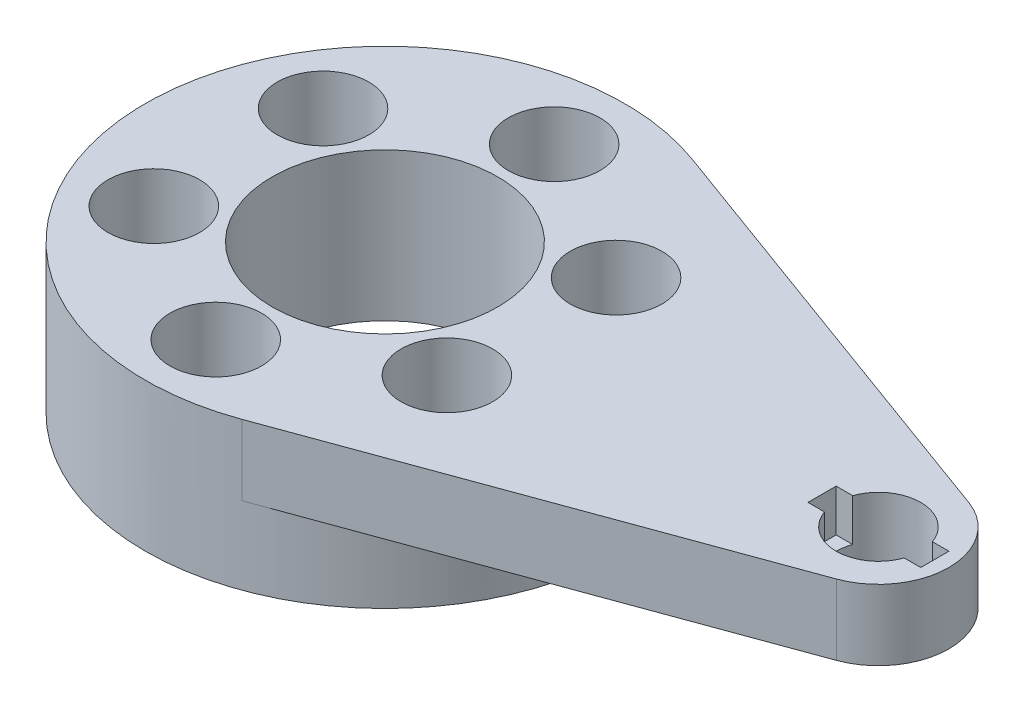
ISO-10303-21;
HEADER;
FILE_DESCRIPTION(('STEP AP214'),'2;1');
FILE_NAME('part.step','',(''),(''),'','','');
FILE_SCHEMA(('AUTOMOTIVE_DESIGN { 1 0 10303 214 1 1 1 1 }'));
ENDSEC;
DATA;
#1=APPLICATION_CONTEXT('core data for automotive mechanical design processes');
#2=APPLICATION_PROTOCOL_DEFINITION('international standard','automotive_design',2000,#1);
#3=PRODUCT_CONTEXT('',#1,'mechanical');
#4=PRODUCT('Part','Part','',(#3));
#5=PRODUCT_RELATED_PRODUCT_CATEGORY('part','',(#4));
#6=PRODUCT_DEFINITION_FORMATION('','',#4);
#7=PRODUCT_DEFINITION_CONTEXT('part definition',#1,'design');
#8=PRODUCT_DEFINITION('design','',#6,#7);
#9=PRODUCT_DEFINITION_SHAPE('','',#8);
#10=(LENGTH_UNIT() NAMED_UNIT(*) SI_UNIT(.MILLI.,.METRE.));
#11=(NAMED_UNIT(*) PLANE_ANGLE_UNIT() SI_UNIT($,.RADIAN.));
#12=(NAMED_UNIT(*) SI_UNIT($,.STERADIAN.) SOLID_ANGLE_UNIT());
#13=UNCERTAINTY_MEASURE_WITH_UNIT(LENGTH_MEASURE(1.E-05),#10,'distance_accuracy_value','');
#14=(GEOMETRIC_REPRESENTATION_CONTEXT(3) GLOBAL_UNCERTAINTY_ASSIGNED_CONTEXT((#13)) GLOBAL_UNIT_ASSIGNED_CONTEXT((#10,
#11,#12)) REPRESENTATION_CONTEXT('',''));
#15=CARTESIAN_POINT('',(0.,0.,0.));
#16=DIRECTION('',(0.,0.,1.));
#17=DIRECTION('',(1.,0.,0.));
#18=AXIS2_PLACEMENT_3D('',#15,#16,#17);
#19=CARTESIAN_POINT('',(-10.3923048454133,5.5,6.));
#20=DIRECTION('',(0.,-1.,0.));
#21=DIRECTION('',(0.,0.,-1.));
#22=AXIS2_PLACEMENT_3D('',#19,#20,#21);
#23=CYLINDRICAL_SURFACE('',#22,2.0000000000008);
#24=CARTESIAN_POINT('',(-10.3923048454133,0.,6.));
#25=DIRECTION('',(0.,1.,0.));
#26=DIRECTION('',(0.,0.,1.));
#27=AXIS2_PLACEMENT_3D('',#24,#25,#26);
#28=CIRCLE('',#27,2.0000000000008);
#29=CARTESIAN_POINT('',(-10.3923048454133,0.,8.0000000000008));
#30=VERTEX_POINT('',#29);
#31=EDGE_CURVE('E384',#30,#30,#28,.T.);
#32=ORIENTED_EDGE('',*,*,#31,.F.);
#33=EDGE_LOOP('',(#32));
#34=FACE_BOUND('',#33,.T.);
#35=CARTESIAN_POINT('',(-10.3923048454133,4.5,6.));
#36=DIRECTION('',(0.,1.,0.));
#37=DIRECTION('',(0.,0.,1.));
#38=AXIS2_PLACEMENT_3D('',#35,#36,#37);
#39=CIRCLE('',#38,2.0000000000008);
#40=CARTESIAN_POINT('',(-10.3923048454133,4.5,8.0000000000008));
#41=VERTEX_POINT('',#40);
#42=EDGE_CURVE('E333',#41,#41,#39,.T.);
#43=ORIENTED_EDGE('',*,*,#42,.T.);
#44=EDGE_LOOP('',(#43));
#45=FACE_BOUND('',#44,.T.);
#46=ADVANCED_FACE('F159',(#34,#45),#23,.F.);
#47=CARTESIAN_POINT('',(0.,5.5,12.));
#48=DIRECTION('',(0.,-1.,0.));
#49=DIRECTION('',(0.,0.,-1.));
#50=AXIS2_PLACEMENT_3D('',#47,#48,#49);
#51=CYLINDRICAL_SURFACE('',#50,2.0000000000013);
#52=CARTESIAN_POINT('',(0.,0.,12.));
#53=DIRECTION('',(0.,1.,0.));
#54=DIRECTION('',(0.,0.,1.));
#55=AXIS2_PLACEMENT_3D('',#52,#53,#54);
#56=CIRCLE('',#55,2.0000000000013);
#57=CARTESIAN_POINT('',(0.,0.,14.0000000000013));
#58=VERTEX_POINT('',#57);
#59=EDGE_CURVE('E381',#58,#58,#56,.T.);
#60=ORIENTED_EDGE('',*,*,#59,.F.);
#61=EDGE_LOOP('',(#60));
#62=FACE_BOUND('',#61,.T.);
#63=CARTESIAN_POINT('',(0.,4.5,12.));
#64=DIRECTION('',(0.,1.,0.));
#65=DIRECTION('',(0.,0.,1.));
#66=AXIS2_PLACEMENT_3D('',#63,#64,#65);
#67=CIRCLE('',#66,2.0000000000013);
#68=CARTESIAN_POINT('',(0.,4.5,14.0000000000013));
#69=VERTEX_POINT('',#68);
#70=EDGE_CURVE('E403',#69,#69,#67,.T.);
#71=ORIENTED_EDGE('',*,*,#70,.T.);
#72=EDGE_LOOP('',(#71));
#73=FACE_BOUND('',#72,.T.);
#74=ADVANCED_FACE('F453',(#62,#73),#51,.F.);
#75=CARTESIAN_POINT('',(10.3923048454133,5.5,6.));
#76=DIRECTION('',(0.,-1.,0.));
#77=DIRECTION('',(0.,0.,-1.));
#78=AXIS2_PLACEMENT_3D('',#75,#76,#77);
#79=CYLINDRICAL_SURFACE('',#78,2.00000000000115);
#80=CARTESIAN_POINT('',(10.3923048454133,0.,6.));
#81=DIRECTION('',(0.,1.,0.));
#82=DIRECTION('',(0.,0.,1.));
#83=AXIS2_PLACEMENT_3D('',#80,#81,#82);
#84=CIRCLE('',#83,2.00000000000115);
#85=CARTESIAN_POINT('',(10.3923048454133,0.,8.00000000000115));
#86=VERTEX_POINT('',#85);
#87=EDGE_CURVE('E378',#86,#86,#84,.T.);
#88=ORIENTED_EDGE('',*,*,#87,.F.);
#89=EDGE_LOOP('',(#88));
#90=FACE_BOUND('',#89,.T.);
#91=CARTESIAN_POINT('',(10.3923048454133,4.5,6.));
#92=DIRECTION('',(0.,1.,0.));
#93=DIRECTION('',(0.,0.,1.));
#94=AXIS2_PLACEMENT_3D('',#91,#92,#93);
#95=CIRCLE('',#94,2.00000000000115);
#96=CARTESIAN_POINT('',(10.3923048454133,4.5,8.00000000000115));
#97=VERTEX_POINT('',#96);
#98=EDGE_CURVE('E400',#97,#97,#95,.T.);
#99=ORIENTED_EDGE('',*,*,#98,.T.);
#100=EDGE_LOOP('',(#99));
#101=FACE_BOUND('',#100,.T.);
#102=ADVANCED_FACE('F459',(#90,#101),#79,.F.);
#103=CARTESIAN_POINT('',(10.3923048454133,5.5,-6.00000000000001));
#104=DIRECTION('',(0.,-1.,0.));
#105=DIRECTION('',(0.,0.,-1.));
#106=AXIS2_PLACEMENT_3D('',#103,#104,#105);
#107=CYLINDRICAL_SURFACE('',#106,2.0000000000005);
#108=CARTESIAN_POINT('',(10.3923048454133,0.,-6.00000000000001));
#109=DIRECTION('',(0.,1.,0.));
#110=DIRECTION('',(0.,0.,1.));
#111=AXIS2_PLACEMENT_3D('',#108,#109,#110);
#112=CIRCLE('',#111,2.0000000000005);
#113=CARTESIAN_POINT('',(10.3923048454133,0.,-3.99999999999951));
#114=VERTEX_POINT('',#113);
#115=EDGE_CURVE('E375',#114,#114,#112,.T.);
#116=ORIENTED_EDGE('',*,*,#115,.F.);
#117=EDGE_LOOP('',(#116));
#118=FACE_BOUND('',#117,.T.);
#119=CARTESIAN_POINT('',(10.3923048454133,4.5,-6.00000000000001));
#120=DIRECTION('',(0.,1.,0.));
#121=DIRECTION('',(0.,0.,1.));
#122=AXIS2_PLACEMENT_3D('',#119,#120,#121);
#123=CIRCLE('',#122,2.0000000000005);
#124=CARTESIAN_POINT('',(10.3923048454133,4.5,-3.99999999999951));
#125=VERTEX_POINT('',#124);
#126=EDGE_CURVE('E397',#125,#125,#123,.T.);
#127=ORIENTED_EDGE('',*,*,#126,.T.);
#128=EDGE_LOOP('',(#127));
#129=FACE_BOUND('',#128,.T.);
#130=ADVANCED_FACE('F470',(#118,#129),#107,.F.);
#131=CARTESIAN_POINT('',(0.,5.5,-12.));
#132=DIRECTION('',(0.,-1.,0.));
#133=DIRECTION('',(0.,0.,-1.));
#134=AXIS2_PLACEMENT_3D('',#131,#132,#133);
#135=CYLINDRICAL_SURFACE('',#134,2.);
#136=CARTESIAN_POINT('',(0.,0.,-12.));
#137=DIRECTION('',(0.,1.,0.));
#138=DIRECTION('',(0.,0.,1.));
#139=AXIS2_PLACEMENT_3D('',#136,#137,#138);
#140=CIRCLE('',#139,2.);
#141=CARTESIAN_POINT('',(0.,0.,-10.));
#142=VERTEX_POINT('',#141);
#143=EDGE_CURVE('E372',#142,#142,#140,.T.);
#144=ORIENTED_EDGE('',*,*,#143,.F.);
#145=EDGE_LOOP('',(#144));
#146=FACE_BOUND('',#145,.T.);
#147=CARTESIAN_POINT('',(0.,4.5,-12.));
#148=DIRECTION('',(0.,1.,0.));
#149=DIRECTION('',(0.,0.,1.));
#150=AXIS2_PLACEMENT_3D('',#147,#148,#149);
#151=CIRCLE('',#150,2.);
#152=CARTESIAN_POINT('',(0.,4.5,-10.));
#153=VERTEX_POINT('',#152);
#154=EDGE_CURVE('E394',#153,#153,#151,.T.);
#155=ORIENTED_EDGE('',*,*,#154,.T.);
#156=EDGE_LOOP('',(#155));
#157=FACE_BOUND('',#156,.T.);
#158=ADVANCED_FACE('F473',(#146,#157),#135,.F.);
#159=CARTESIAN_POINT('',(-10.3923048454133,5.5,-5.99999999999999));
#160=DIRECTION('',(0.,-1.,0.));
#161=DIRECTION('',(0.,0.,-1.));
#162=AXIS2_PLACEMENT_3D('',#159,#160,#161);
#163=CYLINDRICAL_SURFACE('',#162,2.00000000000015);
#164=CARTESIAN_POINT('',(-10.3923048454133,0.,-5.99999999999999));
#165=DIRECTION('',(0.,1.,0.));
#166=DIRECTION('',(0.,0.,1.));
#167=AXIS2_PLACEMENT_3D('',#164,#165,#166);
#168=CIRCLE('',#167,2.00000000000015);
#169=CARTESIAN_POINT('',(-10.3923048454133,0.,-3.99999999999984));
#170=VERTEX_POINT('',#169);
#171=EDGE_CURVE('E357',#170,#170,#168,.T.);
#172=ORIENTED_EDGE('',*,*,#171,.F.);
#173=EDGE_LOOP('',(#172));
#174=FACE_BOUND('',#173,.T.);
#175=CARTESIAN_POINT('',(-10.3923048454133,4.5,-5.99999999999999));
#176=DIRECTION('',(0.,1.,0.));
#177=DIRECTION('',(0.,0.,1.));
#178=AXIS2_PLACEMENT_3D('',#175,#176,#177);
#179=CIRCLE('',#178,2.00000000000015);
#180=CARTESIAN_POINT('',(-10.3923048454133,4.5,-3.99999999999984));
#181=VERTEX_POINT('',#180);
#182=EDGE_CURVE('E323',#181,#181,#179,.T.);
#183=ORIENTED_EDGE('',*,*,#182,.T.);
#184=EDGE_LOOP('',(#183));
#185=FACE_BOUND('',#184,.T.);
#186=ADVANCED_FACE('F161',(#174,#185),#163,.F.);
#187=CARTESIAN_POINT('',(0.,5.5,0.));
#188=DIRECTION('',(0.,-1.,0.));
#189=DIRECTION('',(0.,0.,-1.));
#190=AXIS2_PLACEMENT_3D('',#187,#188,#189);
#191=CYLINDRICAL_SURFACE('',#190,17.);
#192=CARTESIAN_POINT('',(0.,5.5,0.));
#193=DIRECTION('',(0.,1.,0.));
#194=DIRECTION('',(0.,0.,1.));
#195=AXIS2_PLACEMENT_3D('',#192,#193,#194);
#196=CIRCLE('',#195,17.);
#197=CARTESIAN_POINT('',(5.82857142857143,5.5,15.9695884449801));
#198=VERTEX_POINT('',#197);
#199=CARTESIAN_POINT('',(5.82857142857143,5.5,-15.9695884449801));
#200=VERTEX_POINT('',#199);
#201=EDGE_CURVE('E366',#198,#200,#196,.T.);
#202=ORIENTED_EDGE('',*,*,#201,.F.);
#203=DIRECTION('',(0.,-1.,0.));
#204=VECTOR('',#203,1.);
#205=CARTESIAN_POINT('',(5.82857142857143,10.5,15.9695884449801));
#206=LINE('',#205,#204);
#207=CARTESIAN_POINT('',(5.82857142857143,10.5,15.9695884449801));
#208=VERTEX_POINT('',#207);
#209=EDGE_CURVE('E348',#208,#198,#206,.T.);
#210=ORIENTED_EDGE('',*,*,#209,.F.);
#211=CARTESIAN_POINT('',(0.,10.5,0.));
#212=DIRECTION('',(0.,1.,0.));
#213=DIRECTION('',(0.,0.,1.));
#214=AXIS2_PLACEMENT_3D('',#211,#212,#213);
#215=CIRCLE('',#214,17.);
#216=CARTESIAN_POINT('',(5.82857142857143,10.5,-15.9695884449801));
#217=VERTEX_POINT('',#216);
#218=EDGE_CURVE('E341',#217,#208,#215,.T.);
#219=ORIENTED_EDGE('',*,*,#218,.F.);
#220=DIRECTION('',(0.,-1.,0.));
#221=VECTOR('',#220,1.);
#222=CARTESIAN_POINT('',(5.82857142857143,10.5,-15.9695884449801));
#223=LINE('',#222,#221);
#224=EDGE_CURVE('E361',#217,#200,#223,.T.);
#225=ORIENTED_EDGE('',*,*,#224,.T.);
#226=EDGE_LOOP('',(#202,#210,#219,#225));
#227=FACE_BOUND('',#226,.T.);
#228=CARTESIAN_POINT('',(0.,0.,0.));
#229=DIRECTION('',(0.,1.,0.));
#230=DIRECTION('',(0.,0.,1.));
#231=AXIS2_PLACEMENT_3D('',#228,#229,#230);
#232=CIRCLE('',#231,17.);
#233=CARTESIAN_POINT('',(0.,0.,17.));
#234=VERTEX_POINT('',#233);
#235=EDGE_CURVE('E387',#234,#234,#232,.T.);
#236=ORIENTED_EDGE('',*,*,#235,.T.);
#237=EDGE_LOOP('',(#236));
#238=FACE_BOUND('',#237,.T.);
#239=ADVANCED_FACE('F465',(#227,#238),#191,.T.);
#240=CARTESIAN_POINT('',(0.,5.5,0.));
#241=DIRECTION('',(0.,-1.,0.));
#242=DIRECTION('',(0.,0.,-1.));
#243=AXIS2_PLACEMENT_3D('',#240,#241,#242);
#244=CYLINDRICAL_SURFACE('',#243,8.);
#245=CARTESIAN_POINT('',(0.,0.,0.));
#246=DIRECTION('',(0.,1.,0.));
#247=DIRECTION('',(0.,0.,1.));
#248=AXIS2_PLACEMENT_3D('',#245,#246,#247);
#249=CIRCLE('',#248,8.);
#250=CARTESIAN_POINT('',(0.,0.,8.));
#251=VERTEX_POINT('',#250);
#252=EDGE_CURVE('E369',#251,#251,#249,.T.);
#253=ORIENTED_EDGE('',*,*,#252,.F.);
#254=EDGE_LOOP('',(#253));
#255=FACE_BOUND('',#254,.T.);
#256=CARTESIAN_POINT('',(0.,10.5,0.));
#257=DIRECTION('',(0.,1.,0.));
#258=DIRECTION('',(0.,0.,1.));
#259=AXIS2_PLACEMENT_3D('',#256,#257,#258);
#260=CIRCLE('',#259,8.);
#261=CARTESIAN_POINT('',(0.,10.5,8.));
#262=VERTEX_POINT('',#261);
#263=EDGE_CURVE('E334',#262,#262,#260,.T.);
#264=ORIENTED_EDGE('',*,*,#263,.T.);
#265=EDGE_LOOP('',(#264));
#266=FACE_BOUND('',#265,.T.);
#267=ADVANCED_FACE('F530',(#255,#266),#244,.F.);
#268=CARTESIAN_POINT('',(0.,0.,0.));
#269=DIRECTION('',(0.,1.,0.));
#270=DIRECTION('',(0.,0.,1.));
#271=AXIS2_PLACEMENT_3D('',#268,#269,#270);
#272=PLANE('',#271);
#273=ORIENTED_EDGE('',*,*,#171,.T.);
#274=EDGE_LOOP('',(#273));
#275=FACE_BOUND('',#274,.T.);
#276=ORIENTED_EDGE('',*,*,#143,.T.);
#277=EDGE_LOOP('',(#276));
#278=FACE_BOUND('',#277,.T.);
#279=ORIENTED_EDGE('',*,*,#115,.T.);
#280=EDGE_LOOP('',(#279));
#281=FACE_BOUND('',#280,.T.);
#282=ORIENTED_EDGE('',*,*,#87,.T.);
#283=EDGE_LOOP('',(#282));
#284=FACE_BOUND('',#283,.T.);
#285=ORIENTED_EDGE('',*,*,#59,.T.);
#286=EDGE_LOOP('',(#285));
#287=FACE_BOUND('',#286,.T.);
#288=ORIENTED_EDGE('',*,*,#31,.T.);
#289=EDGE_LOOP('',(#288));
#290=FACE_BOUND('',#289,.T.);
#291=ORIENTED_EDGE('',*,*,#235,.F.);
#292=EDGE_LOOP('',(#291));
#293=FACE_BOUND('',#292,.T.);
#294=ORIENTED_EDGE('',*,*,#252,.T.);
#295=EDGE_LOOP('',(#294));
#296=FACE_BOUND('',#295,.T.);
#297=ADVANCED_FACE('F524',(#275,#278,#281,#284,#287,#290,#293,#296),#272,.F.);
#298=CARTESIAN_POINT('',(0.,5.5,0.));
#299=DIRECTION('',(0.,1.,0.));
#300=DIRECTION('',(0.,0.,1.));
#301=AXIS2_PLACEMENT_3D('',#298,#299,#300);
#302=PLANE('',#301);
#303=CARTESIAN_POINT('',(35.,5.5,0.));
#304=DIRECTION('',(0.,1.,0.));
#305=DIRECTION('',(0.,0.,1.));
#306=AXIS2_PLACEMENT_3D('',#303,#304,#305);
#307=CIRCLE('',#306,3.);
#308=CARTESIAN_POINT('',(35.,5.5,3.));
#309=VERTEX_POINT('',#308);
#310=EDGE_CURVE('E330',#309,#309,#307,.T.);
#311=ORIENTED_EDGE('',*,*,#310,.T.);
#312=EDGE_LOOP('',(#311));
#313=FACE_BOUND('',#312,.T.);
#314=DIRECTION('',(-0.939387555587063,0.,0.342857142857143));
#315=VECTOR('',#314,1.);
#316=CARTESIAN_POINT('',(5.82857142857143,5.5,15.9695884449801));
#317=LINE('',#316,#315);
#318=CARTESIAN_POINT('',(36.7142857142857,5.5,4.69693777793532));
#319=VERTEX_POINT('',#318);
#320=EDGE_CURVE('E337',#319,#198,#317,.T.);
#321=ORIENTED_EDGE('',*,*,#320,.T.);
#322=ORIENTED_EDGE('',*,*,#201,.T.);
#323=DIRECTION('',(-0.939387555587063,0.,-0.342857142857143));
#324=VECTOR('',#323,1.);
#325=CARTESIAN_POINT('',(5.82857142857143,5.5,-15.9695884449801));
#326=LINE('',#325,#324);
#327=CARTESIAN_POINT('',(36.7142857142857,5.5,-4.69693777793532));
#328=VERTEX_POINT('',#327);
#329=EDGE_CURVE('E351',#328,#200,#326,.T.);
#330=ORIENTED_EDGE('',*,*,#329,.F.);
#331=CARTESIAN_POINT('',(35.,5.5,0.));
#332=DIRECTION('',(0.,1.,0.));
#333=DIRECTION('',(0.,0.,1.));
#334=AXIS2_PLACEMENT_3D('',#331,#332,#333);
#335=CIRCLE('',#334,5.);
#336=EDGE_CURVE('E342',#319,#328,#335,.T.);
#337=ORIENTED_EDGE('',*,*,#336,.F.);
#338=EDGE_LOOP('',(#321,#322,#330,#337));
#339=FACE_BOUND('',#338,.T.);
#340=ADVANCED_FACE('F501',(#313,#339),#302,.F.);
#341=CARTESIAN_POINT('',(0.,10.5,0.));
#342=DIRECTION('',(0.,1.,0.));
#343=DIRECTION('',(0.,0.,1.));
#344=AXIS2_PLACEMENT_3D('',#341,#342,#343);
#345=PLANE('',#344);
#346=DIRECTION('',(1.,0.,0.));
#347=VECTOR('',#346,1.);
#348=CARTESIAN_POINT('',(31.,10.5,1.));
#349=LINE('',#348,#347);
#350=CARTESIAN_POINT('',(37.8284271247462,10.5,1.));
#351=VERTEX_POINT('',#350);
#352=CARTESIAN_POINT('',(39.,10.5,1.));
#353=VERTEX_POINT('',#352);
#354=EDGE_CURVE('E271',#351,#353,#349,.T.);
#355=ORIENTED_EDGE('',*,*,#354,.F.);
#356=CARTESIAN_POINT('',(35.,10.5,0.));
#357=DIRECTION('',(0.,1.,0.));
#358=DIRECTION('',(0.,0.,1.));
#359=AXIS2_PLACEMENT_3D('',#356,#357,#358);
#360=CIRCLE('',#359,3.);
#361=CARTESIAN_POINT('',(32.1715728752538,10.5,1.));
#362=VERTEX_POINT('',#361);
#363=EDGE_CURVE('E326',#362,#351,#360,.T.);
#364=ORIENTED_EDGE('',*,*,#363,.F.);
#365=CARTESIAN_POINT('',(31.,10.5,1.));
#366=VERTEX_POINT('',#365);
#367=EDGE_CURVE('E269',#366,#362,#349,.T.);
#368=ORIENTED_EDGE('',*,*,#367,.F.);
#369=DIRECTION('',(0.,0.,1.));
#370=VECTOR('',#369,1.);
#371=CARTESIAN_POINT('',(31.,10.5,1.));
#372=LINE('',#371,#370);
#373=CARTESIAN_POINT('',(31.,10.5,-1.));
#374=VERTEX_POINT('',#373);
#375=EDGE_CURVE('E280',#374,#366,#372,.T.);
#376=ORIENTED_EDGE('',*,*,#375,.F.);
#377=DIRECTION('',(-1.,0.,0.));
#378=VECTOR('',#377,1.);
#379=CARTESIAN_POINT('',(31.,10.5,-1.));
#380=LINE('',#379,#378);
#381=CARTESIAN_POINT('',(32.1715728752538,10.5,-1.));
#382=VERTEX_POINT('',#381);
#383=EDGE_CURVE('E277',#382,#374,#380,.T.);
#384=ORIENTED_EDGE('',*,*,#383,.F.);
#385=CARTESIAN_POINT('',(37.8284271247462,10.5,-1.));
#386=VERTEX_POINT('',#385);
#387=EDGE_CURVE('E329',#386,#382,#360,.T.);
#388=ORIENTED_EDGE('',*,*,#387,.F.);
#389=CARTESIAN_POINT('',(39.,10.5,-1.));
#390=VERTEX_POINT('',#389);
#391=EDGE_CURVE('E278',#390,#386,#380,.T.);
#392=ORIENTED_EDGE('',*,*,#391,.F.);
#393=DIRECTION('',(0.,0.,-1.));
#394=VECTOR('',#393,1.);
#395=CARTESIAN_POINT('',(39.,10.5,1.));
#396=LINE('',#395,#394);
#397=EDGE_CURVE('E254',#353,#390,#396,.T.);
#398=ORIENTED_EDGE('',*,*,#397,.F.);
#399=EDGE_LOOP('',(#355,#364,#368,#376,#384,#388,#392,#398));
#400=FACE_BOUND('',#399,.T.);
#401=CARTESIAN_POINT('',(10.3923048454133,10.5,-6.));
#402=DIRECTION('',(0.,1.,0.));
#403=DIRECTION('',(0.,0.,1.));
#404=AXIS2_PLACEMENT_3D('',#401,#402,#403);
#405=CIRCLE('',#404,3.25);
#406=CARTESIAN_POINT('',(10.3923048454133,10.5,-2.75));
#407=VERTEX_POINT('',#406);
#408=EDGE_CURVE('E296',#407,#407,#405,.T.);
#409=ORIENTED_EDGE('',*,*,#408,.F.);
#410=EDGE_LOOP('',(#409));
#411=FACE_BOUND('',#410,.T.);
#412=CARTESIAN_POINT('',(10.3923048454133,10.5,6.));
#413=DIRECTION('',(0.,1.,0.));
#414=DIRECTION('',(0.,0.,1.));
#415=AXIS2_PLACEMENT_3D('',#412,#413,#414);
#416=CIRCLE('',#415,3.25);
#417=CARTESIAN_POINT('',(10.3923048454133,10.5,9.25));
#418=VERTEX_POINT('',#417);
#419=EDGE_CURVE('E303',#418,#418,#416,.T.);
#420=ORIENTED_EDGE('',*,*,#419,.F.);
#421=EDGE_LOOP('',(#420));
#422=FACE_BOUND('',#421,.T.);
#423=CARTESIAN_POINT('',(0.,10.5,12.));
#424=DIRECTION('',(0.,1.,0.));
#425=DIRECTION('',(0.,0.,1.));
#426=AXIS2_PLACEMENT_3D('',#423,#424,#425);
#427=CIRCLE('',#426,3.25);
#428=CARTESIAN_POINT('',(0.,10.5,15.25));
#429=VERTEX_POINT('',#428);
#430=EDGE_CURVE('E309',#429,#429,#427,.T.);
#431=ORIENTED_EDGE('',*,*,#430,.F.);
#432=EDGE_LOOP('',(#431));
#433=FACE_BOUND('',#432,.T.);
#434=CARTESIAN_POINT('',(-10.3923048454133,10.5,6.00000000000001));
#435=DIRECTION('',(0.,1.,0.));
#436=DIRECTION('',(0.,0.,1.));
#437=AXIS2_PLACEMENT_3D('',#434,#435,#436);
#438=CIRCLE('',#437,3.25);
#439=CARTESIAN_POINT('',(-10.3923048454133,10.5,9.25000000000001));
#440=VERTEX_POINT('',#439);
#441=EDGE_CURVE('E315',#440,#440,#438,.T.);
#442=ORIENTED_EDGE('',*,*,#441,.F.);
#443=EDGE_LOOP('',(#442));
#444=FACE_BOUND('',#443,.T.);
#445=CARTESIAN_POINT('',(-10.3923048454133,10.5,-5.99999999999999));
#446=DIRECTION('',(0.,1.,0.));
#447=DIRECTION('',(0.,0.,1.));
#448=AXIS2_PLACEMENT_3D('',#445,#446,#447);
#449=CIRCLE('',#448,3.25);
#450=CARTESIAN_POINT('',(-10.3923048454133,10.5,-2.74999999999999));
#451=VERTEX_POINT('',#450);
#452=EDGE_CURVE('E290',#451,#451,#449,.T.);
#453=ORIENTED_EDGE('',*,*,#452,.F.);
#454=EDGE_LOOP('',(#453));
#455=FACE_BOUND('',#454,.T.);
#456=CARTESIAN_POINT('',(0.,10.5,-12.));
#457=DIRECTION('',(0.,1.,0.));
#458=DIRECTION('',(0.,0.,1.));
#459=AXIS2_PLACEMENT_3D('',#456,#457,#458);
#460=CIRCLE('',#459,3.25);
#461=CARTESIAN_POINT('',(0.,10.5,-8.75));
#462=VERTEX_POINT('',#461);
#463=EDGE_CURVE('E299',#462,#462,#460,.T.);
#464=ORIENTED_EDGE('',*,*,#463,.F.);
#465=EDGE_LOOP('',(#464));
#466=FACE_BOUND('',#465,.T.);
#467=ORIENTED_EDGE('',*,*,#263,.F.);
#468=EDGE_LOOP('',(#467));
#469=FACE_BOUND('',#468,.T.);
#470=DIRECTION('',(-0.939387555587063,0.,0.342857142857143));
#471=VECTOR('',#470,1.);
#472=CARTESIAN_POINT('',(5.82857142857143,10.5,15.9695884449801));
#473=LINE('',#472,#471);
#474=CARTESIAN_POINT('',(36.7142857142857,10.5,4.69693777793532));
#475=VERTEX_POINT('',#474);
#476=EDGE_CURVE('E338',#475,#208,#473,.T.);
#477=ORIENTED_EDGE('',*,*,#476,.F.);
#478=CARTESIAN_POINT('',(35.,10.5,0.));
#479=DIRECTION('',(0.,1.,0.));
#480=DIRECTION('',(0.,0.,1.));
#481=AXIS2_PLACEMENT_3D('',#478,#479,#480);
#482=CIRCLE('',#481,5.);
#483=CARTESIAN_POINT('',(36.7142857142857,10.5,-4.69693777793532));
#484=VERTEX_POINT('',#483);
#485=EDGE_CURVE('E346',#475,#484,#482,.T.);
#486=ORIENTED_EDGE('',*,*,#485,.T.);
#487=DIRECTION('',(-0.939387555587063,0.,-0.342857142857143));
#488=VECTOR('',#487,1.);
#489=CARTESIAN_POINT('',(5.82857142857143,10.5,-15.9695884449801));
#490=LINE('',#489,#488);
#491=EDGE_CURVE('E344',#484,#217,#490,.T.);
#492=ORIENTED_EDGE('',*,*,#491,.T.);
#493=ORIENTED_EDGE('',*,*,#218,.T.);
#494=EDGE_LOOP('',(#477,#486,#492,#493));
#495=FACE_BOUND('',#494,.T.);
#496=ADVANCED_FACE('F425',(#400,#411,#422,#433,#444,#455,#466,#469,#495),#345,.T.);
#497=CARTESIAN_POINT('',(5.82857142857143,10.5,15.9695884449801));
#498=DIRECTION('',(0.342857142857143,0.,0.939387555587063));
#499=DIRECTION('',(0.939387555587063,0.,-0.342857142857143));
#500=AXIS2_PLACEMENT_3D('',#497,#498,#499);
#501=PLANE('',#500);
#502=ORIENTED_EDGE('',*,*,#320,.F.);
#503=DIRECTION('',(0.,-1.,0.));
#504=VECTOR('',#503,1.);
#505=CARTESIAN_POINT('',(36.7142857142857,10.5,4.69693777793532));
#506=LINE('',#505,#504);
#507=EDGE_CURVE('E355',#475,#319,#506,.T.);
#508=ORIENTED_EDGE('',*,*,#507,.F.);
#509=ORIENTED_EDGE('',*,*,#476,.T.);
#510=ORIENTED_EDGE('',*,*,#209,.T.);
#511=EDGE_LOOP('',(#502,#508,#509,#510));
#512=FACE_BOUND('',#511,.T.);
#513=ADVANCED_FACE('F500',(#512),#501,.T.);
#514=CARTESIAN_POINT('',(35.,10.5,0.));
#515=DIRECTION('',(0.,-1.,0.));
#516=DIRECTION('',(0.,0.,-1.));
#517=AXIS2_PLACEMENT_3D('',#514,#515,#516);
#518=CYLINDRICAL_SURFACE('',#517,5.);
#519=ORIENTED_EDGE('',*,*,#336,.T.);
#520=DIRECTION('',(0.,-1.,0.));
#521=VECTOR('',#520,1.);
#522=CARTESIAN_POINT('',(36.7142857142857,10.5,-4.69693777793532));
#523=LINE('',#522,#521);
#524=EDGE_CURVE('E358',#484,#328,#523,.T.);
#525=ORIENTED_EDGE('',*,*,#524,.F.);
#526=ORIENTED_EDGE('',*,*,#485,.F.);
#527=ORIENTED_EDGE('',*,*,#507,.T.);
#528=EDGE_LOOP('',(#519,#525,#526,#527));
#529=FACE_BOUND('',#528,.T.);
#530=ADVANCED_FACE('F514',(#529),#518,.T.);
#531=CARTESIAN_POINT('',(5.82857142857143,10.5,-15.9695884449801));
#532=DIRECTION('',(-0.342857142857143,0.,0.939387555587063));
#533=DIRECTION('',(0.939387555587063,0.,0.342857142857143));
#534=AXIS2_PLACEMENT_3D('',#531,#532,#533);
#535=PLANE('',#534);
#536=ORIENTED_EDGE('',*,*,#329,.T.);
#537=ORIENTED_EDGE('',*,*,#224,.F.);
#538=ORIENTED_EDGE('',*,*,#491,.F.);
#539=ORIENTED_EDGE('',*,*,#524,.T.);
#540=EDGE_LOOP('',(#536,#537,#538,#539));
#541=FACE_BOUND('',#540,.T.);
#542=ADVANCED_FACE('F519',(#541),#535,.F.);
#543=CARTESIAN_POINT('',(35.,10.5,0.));
#544=DIRECTION('',(0.,-1.,0.));
#545=DIRECTION('',(0.,0.,-1.));
#546=AXIS2_PLACEMENT_3D('',#543,#544,#545);
#547=CYLINDRICAL_SURFACE('',#546,3.);
#548=DIRECTION('',(0.,-1.,0.));
#549=VECTOR('',#548,1.);
#550=CARTESIAN_POINT('',(37.8284271247462,10.5,1.));
#551=LINE('',#550,#549);
#552=CARTESIAN_POINT('',(37.8284271247462,7.5,1.));
#553=VERTEX_POINT('',#552);
#554=EDGE_CURVE('E12',#553,#351,#551,.F.);
#555=ORIENTED_EDGE('',*,*,#554,.F.);
#556=CARTESIAN_POINT('',(35.,7.5,0.));
#557=DIRECTION('',(0.,-1.,0.));
#558=DIRECTION('',(0.,0.,-1.));
#559=AXIS2_PLACEMENT_3D('',#556,#557,#558);
#560=CIRCLE('',#559,3.);
#561=CARTESIAN_POINT('',(37.8284271247462,7.5,-1.));
#562=VERTEX_POINT('',#561);
#563=EDGE_CURVE('E410',#562,#553,#560,.T.);
#564=ORIENTED_EDGE('',*,*,#563,.F.);
#565=DIRECTION('',(0.,-1.,0.));
#566=VECTOR('',#565,1.);
#567=CARTESIAN_POINT('',(37.8284271247462,10.5,-1.));
#568=LINE('',#567,#566);
#569=EDGE_CURVE('E167',#386,#562,#568,.T.);
#570=ORIENTED_EDGE('',*,*,#569,.F.);
#571=ORIENTED_EDGE('',*,*,#387,.T.);
#572=DIRECTION('',(0.,-1.,0.));
#573=VECTOR('',#572,1.);
#574=CARTESIAN_POINT('',(32.1715728752538,10.5,-1.));
#575=LINE('',#574,#573);
#576=CARTESIAN_POINT('',(32.1715728752538,7.5,-1.));
#577=VERTEX_POINT('',#576);
#578=EDGE_CURVE('E409',#577,#382,#575,.F.);
#579=ORIENTED_EDGE('',*,*,#578,.F.);
#580=CARTESIAN_POINT('',(32.1715728752538,7.5,1.));
#581=VERTEX_POINT('',#580);
#582=EDGE_CURVE('E368',#581,#577,#560,.T.);
#583=ORIENTED_EDGE('',*,*,#582,.F.);
#584=DIRECTION('',(0.,-1.,0.));
#585=VECTOR('',#584,1.);
#586=CARTESIAN_POINT('',(32.1715728752538,10.5,1.));
#587=LINE('',#586,#585);
#588=EDGE_CURVE('E412',#362,#581,#587,.T.);
#589=ORIENTED_EDGE('',*,*,#588,.F.);
#590=ORIENTED_EDGE('',*,*,#363,.T.);
#591=EDGE_LOOP('',(#555,#564,#570,#571,#579,#583,#589,#590));
#592=FACE_BOUND('',#591,.T.);
#593=ORIENTED_EDGE('',*,*,#310,.F.);
#594=EDGE_LOOP('',(#593));
#595=FACE_BOUND('',#594,.T.);
#596=ADVANCED_FACE('F418',(#592,#595),#547,.F.);
#597=CARTESIAN_POINT('',(0.,4.5,-12.));
#598=DIRECTION('',(0.,1.,0.));
#599=DIRECTION('',(0.,0.,1.));
#600=AXIS2_PLACEMENT_3D('',#597,#598,#599);
#601=CYLINDRICAL_SURFACE('',#600,3.25);
#602=CARTESIAN_POINT('',(0.,4.5,-12.));
#603=DIRECTION('',(0.,1.,0.));
#604=DIRECTION('',(0.,0.,1.));
#605=AXIS2_PLACEMENT_3D('',#602,#603,#604);
#606=CIRCLE('',#605,3.25);
#607=CARTESIAN_POINT('',(0.,4.5,-8.75));
#608=VERTEX_POINT('',#607);
#609=EDGE_CURVE('E320',#608,#608,#606,.T.);
#610=ORIENTED_EDGE('',*,*,#609,.F.);
#611=EDGE_LOOP('',(#610));
#612=FACE_BOUND('',#611,.T.);
#613=ORIENTED_EDGE('',*,*,#463,.T.);
#614=EDGE_LOOP('',(#613));
#615=FACE_BOUND('',#614,.T.);
#616=ADVANCED_FACE('F489',(#612,#615),#601,.F.);
#617=CARTESIAN_POINT('',(0.,4.5,-12.));
#618=DIRECTION('',(0.,1.,0.));
#619=DIRECTION('',(0.,0.,1.));
#620=AXIS2_PLACEMENT_3D('',#617,#618,#619);
#621=PLANE('',#620);
#622=ORIENTED_EDGE('',*,*,#154,.F.);
#623=EDGE_LOOP('',(#622));
#624=FACE_BOUND('',#623,.T.);
#625=ORIENTED_EDGE('',*,*,#609,.T.);
#626=EDGE_LOOP('',(#625));
#627=FACE_BOUND('',#626,.T.);
#628=ADVANCED_FACE('F485',(#624,#627),#621,.T.);
#629=CARTESIAN_POINT('',(-10.3923048454133,4.5,-5.99999999999999));
#630=DIRECTION('',(0.,1.,0.));
#631=DIRECTION('',(0.,0.,1.));
#632=AXIS2_PLACEMENT_3D('',#629,#630,#631);
#633=CYLINDRICAL_SURFACE('',#632,3.25);
#634=CARTESIAN_POINT('',(-10.3923048454133,4.5,-5.99999999999999));
#635=DIRECTION('',(0.,1.,0.));
#636=DIRECTION('',(0.,0.,1.));
#637=AXIS2_PLACEMENT_3D('',#634,#635,#636);
#638=CIRCLE('',#637,3.25);
#639=CARTESIAN_POINT('',(-10.3923048454133,4.5,-2.74999999999999));
#640=VERTEX_POINT('',#639);
#641=EDGE_CURVE('E285',#640,#640,#638,.T.);
#642=ORIENTED_EDGE('',*,*,#641,.F.);
#643=EDGE_LOOP('',(#642));
#644=FACE_BOUND('',#643,.T.);
#645=ORIENTED_EDGE('',*,*,#452,.T.);
#646=EDGE_LOOP('',(#645));
#647=FACE_BOUND('',#646,.T.);
#648=ADVANCED_FACE('F488',(#644,#647),#633,.F.);
#649=CARTESIAN_POINT('',(-10.3923048454133,4.5,-5.99999999999999));
#650=DIRECTION('',(0.,1.,0.));
#651=DIRECTION('',(0.,0.,1.));
#652=AXIS2_PLACEMENT_3D('',#649,#650,#651);
#653=PLANE('',#652);
#654=ORIENTED_EDGE('',*,*,#182,.F.);
#655=EDGE_LOOP('',(#654));
#656=FACE_BOUND('',#655,.T.);
#657=ORIENTED_EDGE('',*,*,#641,.T.);
#658=EDGE_LOOP('',(#657));
#659=FACE_BOUND('',#658,.T.);
#660=ADVANCED_FACE('F584',(#656,#659),#653,.T.);
#661=CARTESIAN_POINT('',(-10.3923048454133,4.5,6.00000000000001));
#662=DIRECTION('',(0.,1.,0.));
#663=DIRECTION('',(0.,0.,1.));
#664=AXIS2_PLACEMENT_3D('',#661,#662,#663);
#665=CYLINDRICAL_SURFACE('',#664,3.25);
#666=CARTESIAN_POINT('',(-10.3923048454133,4.5,6.00000000000001));
#667=DIRECTION('',(0.,1.,0.));
#668=DIRECTION('',(0.,0.,1.));
#669=AXIS2_PLACEMENT_3D('',#666,#667,#668);
#670=CIRCLE('',#669,3.25);
#671=CARTESIAN_POINT('',(-10.3923048454133,4.5,9.25000000000001));
#672=VERTEX_POINT('',#671);
#673=EDGE_CURVE('E293',#672,#672,#670,.T.);
#674=ORIENTED_EDGE('',*,*,#673,.F.);
#675=EDGE_LOOP('',(#674));
#676=FACE_BOUND('',#675,.T.);
#677=ORIENTED_EDGE('',*,*,#441,.T.);
#678=EDGE_LOOP('',(#677));
#679=FACE_BOUND('',#678,.T.);
#680=ADVANCED_FACE('F595',(#676,#679),#665,.F.);
#681=CARTESIAN_POINT('',(-10.3923048454133,4.5,6.00000000000001));
#682=DIRECTION('',(0.,1.,0.));
#683=DIRECTION('',(0.,0.,1.));
#684=AXIS2_PLACEMENT_3D('',#681,#682,#683);
#685=PLANE('',#684);
#686=ORIENTED_EDGE('',*,*,#42,.F.);
#687=EDGE_LOOP('',(#686));
#688=FACE_BOUND('',#687,.T.);
#689=ORIENTED_EDGE('',*,*,#673,.T.);
#690=EDGE_LOOP('',(#689));
#691=FACE_BOUND('',#690,.T.);
#692=ADVANCED_FACE('F606',(#688,#691),#685,.T.);
#693=CARTESIAN_POINT('',(0.,4.5,12.));
#694=DIRECTION('',(0.,1.,0.));
#695=DIRECTION('',(0.,0.,1.));
#696=AXIS2_PLACEMENT_3D('',#693,#694,#695);
#697=CYLINDRICAL_SURFACE('',#696,3.25);
#698=CARTESIAN_POINT('',(0.,4.5,12.));
#699=DIRECTION('',(0.,1.,0.));
#700=DIRECTION('',(0.,0.,1.));
#701=AXIS2_PLACEMENT_3D('',#698,#699,#700);
#702=CIRCLE('',#701,3.25);
#703=CARTESIAN_POINT('',(0.,4.5,15.25));
#704=VERTEX_POINT('',#703);
#705=EDGE_CURVE('E312',#704,#704,#702,.T.);
#706=ORIENTED_EDGE('',*,*,#705,.F.);
#707=EDGE_LOOP('',(#706));
#708=FACE_BOUND('',#707,.T.);
#709=ORIENTED_EDGE('',*,*,#430,.T.);
#710=EDGE_LOOP('',(#709));
#711=FACE_BOUND('',#710,.T.);
#712=ADVANCED_FACE('F617',(#708,#711),#697,.F.);
#713=CARTESIAN_POINT('',(0.,4.5,12.));
#714=DIRECTION('',(0.,1.,0.));
#715=DIRECTION('',(0.,0.,1.));
#716=AXIS2_PLACEMENT_3D('',#713,#714,#715);
#717=PLANE('',#716);
#718=ORIENTED_EDGE('',*,*,#70,.F.);
#719=EDGE_LOOP('',(#718));
#720=FACE_BOUND('',#719,.T.);
#721=ORIENTED_EDGE('',*,*,#705,.T.);
#722=EDGE_LOOP('',(#721));
#723=FACE_BOUND('',#722,.T.);
#724=ADVANCED_FACE('F628',(#720,#723),#717,.T.);
#725=CARTESIAN_POINT('',(10.3923048454133,4.5,6.));
#726=DIRECTION('',(0.,1.,0.));
#727=DIRECTION('',(0.,0.,1.));
#728=AXIS2_PLACEMENT_3D('',#725,#726,#727);
#729=CYLINDRICAL_SURFACE('',#728,3.25);
#730=CARTESIAN_POINT('',(10.3923048454133,4.5,6.));
#731=DIRECTION('',(0.,1.,0.));
#732=DIRECTION('',(0.,0.,1.));
#733=AXIS2_PLACEMENT_3D('',#730,#731,#732);
#734=CIRCLE('',#733,3.25);
#735=CARTESIAN_POINT('',(10.3923048454133,4.5,9.25));
#736=VERTEX_POINT('',#735);
#737=EDGE_CURVE('E306',#736,#736,#734,.T.);
#738=ORIENTED_EDGE('',*,*,#737,.F.);
#739=EDGE_LOOP('',(#738));
#740=FACE_BOUND('',#739,.T.);
#741=ORIENTED_EDGE('',*,*,#419,.T.);
#742=EDGE_LOOP('',(#741));
#743=FACE_BOUND('',#742,.T.);
#744=ADVANCED_FACE('F639',(#740,#743),#729,.F.);
#745=CARTESIAN_POINT('',(10.3923048454133,4.5,6.));
#746=DIRECTION('',(0.,1.,0.));
#747=DIRECTION('',(0.,0.,1.));
#748=AXIS2_PLACEMENT_3D('',#745,#746,#747);
#749=PLANE('',#748);
#750=ORIENTED_EDGE('',*,*,#98,.F.);
#751=EDGE_LOOP('',(#750));
#752=FACE_BOUND('',#751,.T.);
#753=ORIENTED_EDGE('',*,*,#737,.T.);
#754=EDGE_LOOP('',(#753));
#755=FACE_BOUND('',#754,.T.);
#756=ADVANCED_FACE('F650',(#752,#755),#749,.T.);
#757=CARTESIAN_POINT('',(10.3923048454133,4.5,-6.));
#758=DIRECTION('',(0.,1.,0.));
#759=DIRECTION('',(0.,0.,1.));
#760=AXIS2_PLACEMENT_3D('',#757,#758,#759);
#761=CYLINDRICAL_SURFACE('',#760,3.25);
#762=CARTESIAN_POINT('',(10.3923048454133,4.5,-6.));
#763=DIRECTION('',(0.,1.,0.));
#764=DIRECTION('',(0.,0.,1.));
#765=AXIS2_PLACEMENT_3D('',#762,#763,#764);
#766=CIRCLE('',#765,3.25);
#767=CARTESIAN_POINT('',(10.3923048454133,4.5,-2.75));
#768=VERTEX_POINT('',#767);
#769=EDGE_CURVE('E300',#768,#768,#766,.T.);
#770=ORIENTED_EDGE('',*,*,#769,.F.);
#771=EDGE_LOOP('',(#770));
#772=FACE_BOUND('',#771,.T.);
#773=ORIENTED_EDGE('',*,*,#408,.T.);
#774=EDGE_LOOP('',(#773));
#775=FACE_BOUND('',#774,.T.);
#776=ADVANCED_FACE('F661',(#772,#775),#761,.F.);
#777=CARTESIAN_POINT('',(10.3923048454133,4.5,-6.));
#778=DIRECTION('',(0.,1.,0.));
#779=DIRECTION('',(0.,0.,1.));
#780=AXIS2_PLACEMENT_3D('',#777,#778,#779);
#781=PLANE('',#780);
#782=ORIENTED_EDGE('',*,*,#126,.F.);
#783=EDGE_LOOP('',(#782));
#784=FACE_BOUND('',#783,.T.);
#785=ORIENTED_EDGE('',*,*,#769,.T.);
#786=EDGE_LOOP('',(#785));
#787=FACE_BOUND('',#786,.T.);
#788=ADVANCED_FACE('F672',(#784,#787),#781,.T.);
#789=CARTESIAN_POINT('',(0.,7.5,0.));
#790=DIRECTION('',(0.,-1.,0.));
#791=DIRECTION('',(0.,0.,-1.));
#792=AXIS2_PLACEMENT_3D('',#789,#790,#791);
#793=PLANE('',#792);
#794=ORIENTED_EDGE('',*,*,#582,.T.);
#795=DIRECTION('',(-1.,0.,0.));
#796=VECTOR('',#795,1.);
#797=CARTESIAN_POINT('',(31.,7.5,-1.));
#798=LINE('',#797,#796);
#799=CARTESIAN_POINT('',(31.,7.5,-1.));
#800=VERTEX_POINT('',#799);
#801=EDGE_CURVE('E263',#577,#800,#798,.T.);
#802=ORIENTED_EDGE('',*,*,#801,.T.);
#803=DIRECTION('',(0.,0.,1.));
#804=VECTOR('',#803,1.);
#805=CARTESIAN_POINT('',(31.,7.5,1.));
#806=LINE('',#805,#804);
#807=CARTESIAN_POINT('',(31.,7.5,1.));
#808=VERTEX_POINT('',#807);
#809=EDGE_CURVE('E262',#800,#808,#806,.T.);
#810=ORIENTED_EDGE('',*,*,#809,.T.);
#811=DIRECTION('',(1.,0.,0.));
#812=VECTOR('',#811,1.);
#813=CARTESIAN_POINT('',(31.,7.5,1.));
#814=LINE('',#813,#812);
#815=EDGE_CURVE('E182',#808,#581,#814,.T.);
#816=ORIENTED_EDGE('',*,*,#815,.T.);
#817=EDGE_LOOP('',(#794,#802,#810,#816));
#818=FACE_BOUND('',#817,.T.);
#819=ADVANCED_FACE('F439',(#818),#793,.F.);
#820=CARTESIAN_POINT('',(31.,7.5,-1.));
#821=DIRECTION('',(0.,0.,-1.));
#822=DIRECTION('',(-1.,0.,0.));
#823=AXIS2_PLACEMENT_3D('',#820,#821,#822);
#824=PLANE('',#823);
#825=ORIENTED_EDGE('',*,*,#578,.T.);
#826=ORIENTED_EDGE('',*,*,#383,.T.);
#827=DIRECTION('',(0.,1.,0.));
#828=VECTOR('',#827,1.);
#829=CARTESIAN_POINT('',(31.,7.5,-1.));
#830=LINE('',#829,#828);
#831=EDGE_CURVE('E257',#800,#374,#830,.T.);
#832=ORIENTED_EDGE('',*,*,#831,.F.);
#833=ORIENTED_EDGE('',*,*,#801,.F.);
#834=EDGE_LOOP('',(#825,#826,#832,#833));
#835=FACE_BOUND('',#834,.T.);
#836=ADVANCED_FACE('F434',(#835),#824,.F.);
#837=CARTESIAN_POINT('',(31.,7.5,1.));
#838=DIRECTION('',(0.,0.,1.));
#839=DIRECTION('',(1.,0.,0.));
#840=AXIS2_PLACEMENT_3D('',#837,#838,#839);
#841=PLANE('',#840);
#842=ORIENTED_EDGE('',*,*,#588,.T.);
#843=ORIENTED_EDGE('',*,*,#815,.F.);
#844=DIRECTION('',(0.,1.,0.));
#845=VECTOR('',#844,1.);
#846=CARTESIAN_POINT('',(31.,7.5,1.));
#847=LINE('',#846,#845);
#848=EDGE_CURVE('E286',#808,#366,#847,.T.);
#849=ORIENTED_EDGE('',*,*,#848,.T.);
#850=ORIENTED_EDGE('',*,*,#367,.T.);
#851=EDGE_LOOP('',(#842,#843,#849,#850));
#852=FACE_BOUND('',#851,.T.);
#853=ADVANCED_FACE('F441',(#852),#841,.F.);
#854=CARTESIAN_POINT('',(31.,7.5,1.));
#855=DIRECTION('',(-1.,0.,0.));
#856=DIRECTION('',(0.,0.,1.));
#857=AXIS2_PLACEMENT_3D('',#854,#855,#856);
#858=PLANE('',#857);
#859=ORIENTED_EDGE('',*,*,#375,.T.);
#860=ORIENTED_EDGE('',*,*,#848,.F.);
#861=ORIENTED_EDGE('',*,*,#809,.F.);
#862=ORIENTED_EDGE('',*,*,#831,.T.);
#863=EDGE_LOOP('',(#859,#860,#861,#862));
#864=FACE_BOUND('',#863,.T.);
#865=ADVANCED_FACE('F437',(#864),#858,.F.);
#866=ORIENTED_EDGE('',*,*,#569,.T.);
#867=CARTESIAN_POINT('',(39.,7.5,-1.));
#868=VERTEX_POINT('',#867);
#869=EDGE_CURVE('E174',#868,#562,#798,.T.);
#870=ORIENTED_EDGE('',*,*,#869,.F.);
#871=DIRECTION('',(0.,1.,0.));
#872=VECTOR('',#871,1.);
#873=CARTESIAN_POINT('',(39.,7.5,-1.));
#874=LINE('',#873,#872);
#875=EDGE_CURVE('E249',#868,#390,#874,.T.);
#876=ORIENTED_EDGE('',*,*,#875,.T.);
#877=ORIENTED_EDGE('',*,*,#391,.T.);
#878=EDGE_LOOP('',(#866,#870,#876,#877));
#879=FACE_BOUND('',#878,.T.);
#880=ADVANCED_FACE('F259',(#879),#824,.F.);
#881=ORIENTED_EDGE('',*,*,#563,.T.);
#882=CARTESIAN_POINT('',(39.,7.5,1.));
#883=VERTEX_POINT('',#882);
#884=EDGE_CURVE('E267',#553,#883,#814,.T.);
#885=ORIENTED_EDGE('',*,*,#884,.T.);
#886=DIRECTION('',(0.,0.,-1.));
#887=VECTOR('',#886,1.);
#888=CARTESIAN_POINT('',(39.,7.5,1.));
#889=LINE('',#888,#887);
#890=EDGE_CURVE('E252',#883,#868,#889,.T.);
#891=ORIENTED_EDGE('',*,*,#890,.T.);
#892=ORIENTED_EDGE('',*,*,#869,.T.);
#893=EDGE_LOOP('',(#881,#885,#891,#892));
#894=FACE_BOUND('',#893,.T.);
#895=ADVANCED_FACE('F265',(#894),#793,.F.);
#896=CARTESIAN_POINT('',(39.,7.5,1.));
#897=DIRECTION('',(1.,0.,0.));
#898=DIRECTION('',(0.,0.,-1.));
#899=AXIS2_PLACEMENT_3D('',#896,#897,#898);
#900=PLANE('',#899);
#901=ORIENTED_EDGE('',*,*,#397,.T.);
#902=ORIENTED_EDGE('',*,*,#875,.F.);
#903=ORIENTED_EDGE('',*,*,#890,.F.);
#904=DIRECTION('',(0.,1.,0.));
#905=VECTOR('',#904,1.);
#906=CARTESIAN_POINT('',(39.,7.5,1.));
#907=LINE('',#906,#905);
#908=EDGE_CURVE('E283',#883,#353,#907,.T.);
#909=ORIENTED_EDGE('',*,*,#908,.T.);
#910=EDGE_LOOP('',(#901,#902,#903,#909));
#911=FACE_BOUND('',#910,.T.);
#912=ADVANCED_FACE('F250',(#911),#900,.F.);
#913=ORIENTED_EDGE('',*,*,#554,.T.);
#914=ORIENTED_EDGE('',*,*,#354,.T.);
#915=ORIENTED_EDGE('',*,*,#908,.F.);
#916=ORIENTED_EDGE('',*,*,#884,.F.);
#917=EDGE_LOOP('',(#913,#914,#915,#916));
#918=FACE_BOUND('',#917,.T.);
#919=ADVANCED_FACE('F416',(#918),#841,.F.);
#920=CLOSED_SHELL('',(#46,#74,#102,#130,#158,#186,#239,#267,#297,#340,#496,#513,#530,#542,#596,
#616,#628,#648,#660,#680,#692,#712,#724,#744,#756,#776,#788,#819,#836,#853,#865,#880,#895,#912,#919));
#921=MANIFOLD_SOLID_BREP('B2',#920);
#922=ADVANCED_BREP_SHAPE_REPRESENTATION('',(#18,#921),#14);
#923=SHAPE_DEFINITION_REPRESENTATION(#9,#922);
ENDSEC;
END-ISO-10303-21;
